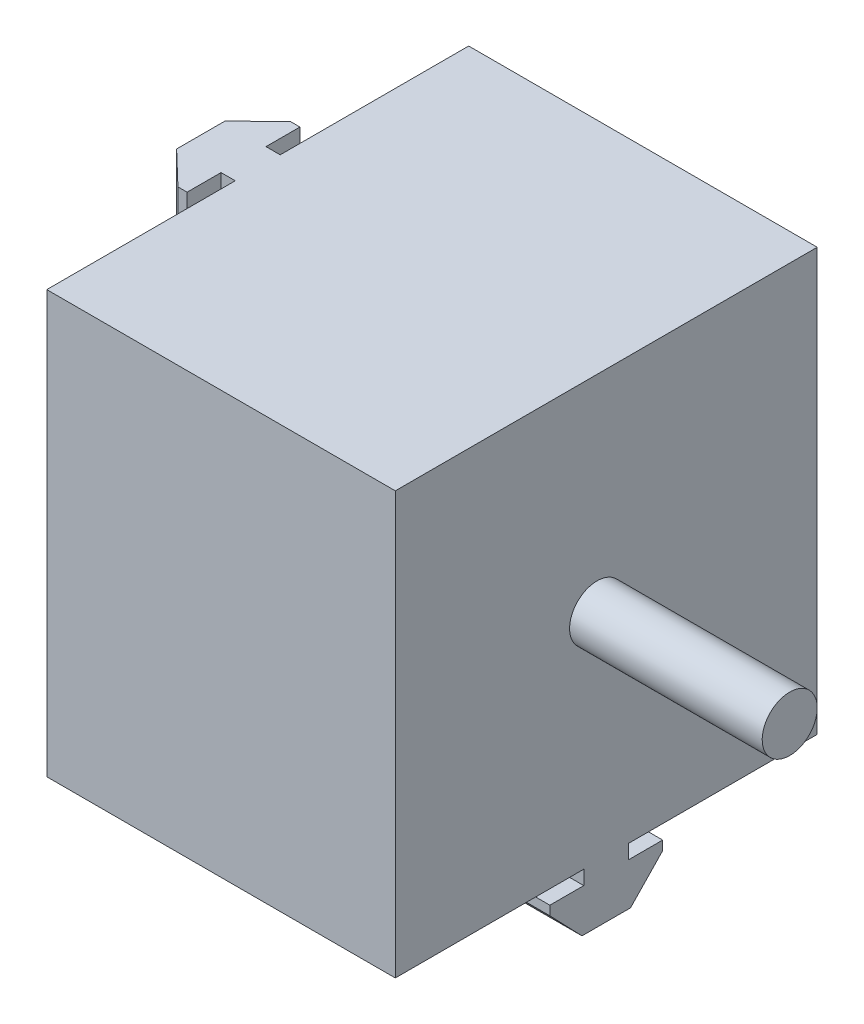
ISO-10303-21;
HEADER;
FILE_DESCRIPTION(('STEP AP214'),'2;1');
FILE_NAME('part.step','',(''),(''),'','','');
FILE_SCHEMA(('AUTOMOTIVE_DESIGN { 1 0 10303 214 1 1 1 1 }'));
ENDSEC;
DATA;
#1=APPLICATION_CONTEXT('core data for automotive mechanical design processes');
#2=APPLICATION_PROTOCOL_DEFINITION('international standard','automotive_design',2000,#1);
#3=PRODUCT_CONTEXT('',#1,'mechanical');
#4=PRODUCT('Part','Part','',(#3));
#5=PRODUCT_RELATED_PRODUCT_CATEGORY('part','',(#4));
#6=PRODUCT_DEFINITION_FORMATION('','',#4);
#7=PRODUCT_DEFINITION_CONTEXT('part definition',#1,'design');
#8=PRODUCT_DEFINITION('design','',#6,#7);
#9=PRODUCT_DEFINITION_SHAPE('','',#8);
#10=(LENGTH_UNIT() NAMED_UNIT(*) SI_UNIT(.MILLI.,.METRE.));
#11=(NAMED_UNIT(*) PLANE_ANGLE_UNIT() SI_UNIT($,.RADIAN.));
#12=(NAMED_UNIT(*) SI_UNIT($,.STERADIAN.) SOLID_ANGLE_UNIT());
#13=UNCERTAINTY_MEASURE_WITH_UNIT(LENGTH_MEASURE(1.E-05),#10,'distance_accuracy_value','');
#14=(GEOMETRIC_REPRESENTATION_CONTEXT(3) GLOBAL_UNCERTAINTY_ASSIGNED_CONTEXT((#13)) GLOBAL_UNIT_ASSIGNED_CONTEXT((#10,
#11,#12)) REPRESENTATION_CONTEXT('',''));
#15=CARTESIAN_POINT('',(0.,0.,0.));
#16=DIRECTION('',(0.,0.,1.));
#17=DIRECTION('',(1.,0.,0.));
#18=AXIS2_PLACEMENT_3D('',#15,#16,#17);
#19=CARTESIAN_POINT('',(129.653184518172,-19.9,0.));
#20=DIRECTION('',(0.,-1.,0.));
#21=DIRECTION('',(1.,0.,0.));
#22=AXIS2_PLACEMENT_3D('',#19,#20,#21);
#23=PLANE('',#22);
#24=DIRECTION('',(0.,0.,-1.));
#25=VECTOR('',#24,1.);
#26=CARTESIAN_POINT('',(-15.9,-19.9,0.));
#27=LINE('',#26,#25);
#28=CARTESIAN_POINT('',(-15.9,-19.9,23.65));
#29=VERTEX_POINT('',#28);
#30=CARTESIAN_POINT('',(-15.9,-19.9,3.1));
#31=VERTEX_POINT('',#30);
#32=EDGE_CURVE('E262',#29,#31,#27,.T.);
#33=ORIENTED_EDGE('',*,*,#32,.T.);
#34=DIRECTION('',(1.,0.,0.));
#35=VECTOR('',#34,1.);
#36=CARTESIAN_POINT('',(22.1,-19.9,3.1));
#37=LINE('',#36,#35);
#38=CARTESIAN_POINT('',(22.1,-19.9,3.1));
#39=VERTEX_POINT('',#38);
#40=EDGE_CURVE('E48',#31,#39,#37,.T.);
#41=ORIENTED_EDGE('',*,*,#40,.T.);
#42=DIRECTION('',(0.,0.,-1.));
#43=VECTOR('',#42,1.);
#44=CARTESIAN_POINT('',(22.1,-19.9,0.));
#45=LINE('',#44,#43);
#46=CARTESIAN_POINT('',(22.1,-19.9,23.65));
#47=VERTEX_POINT('',#46);
#48=EDGE_CURVE('E201',#47,#39,#45,.T.);
#49=ORIENTED_EDGE('',*,*,#48,.F.);
#50=DIRECTION('',(-1.,0.,0.));
#51=VECTOR('',#50,1.);
#52=CARTESIAN_POINT('',(129.653184518172,-19.9,23.65));
#53=LINE('',#52,#51);
#54=EDGE_CURVE('E335',#47,#29,#53,.T.);
#55=ORIENTED_EDGE('',*,*,#54,.T.);
#56=EDGE_LOOP('',(#33,#41,#49,#55));
#57=FACE_BOUND('',#56,.T.);
#58=ADVANCED_FACE('F33',(#57),#23,.T.);
#59=CARTESIAN_POINT('',(-22.1,26.1,52.2));
#60=DIRECTION('',(0.,-1.,0.));
#61=DIRECTION('',(0.,0.,-1.));
#62=AXIS2_PLACEMENT_3D('',#59,#60,#61);
#63=PLANE('',#62);
#64=DIRECTION('',(1.,0.,0.));
#65=VECTOR('',#64,1.);
#66=CARTESIAN_POINT('',(22.1,26.1,3.1));
#67=LINE('',#66,#65);
#68=CARTESIAN_POINT('',(-15.9,26.1,3.1));
#69=VERTEX_POINT('',#68);
#70=CARTESIAN_POINT('',(22.1,26.1,3.1));
#71=VERTEX_POINT('',#70);
#72=EDGE_CURVE('E188',#69,#71,#67,.T.);
#73=ORIENTED_EDGE('',*,*,#72,.F.);
#74=DIRECTION('',(0.,0.,-1.));
#75=VECTOR('',#74,1.);
#76=CARTESIAN_POINT('',(-15.9,26.1,0.));
#77=LINE('',#76,#75);
#78=CARTESIAN_POINT('',(-15.9,26.1,23.65));
#79=VERTEX_POINT('',#78);
#80=EDGE_CURVE('E266',#79,#69,#77,.T.);
#81=ORIENTED_EDGE('',*,*,#80,.F.);
#82=DIRECTION('',(1.,0.,0.));
#83=VECTOR('',#82,1.);
#84=CARTESIAN_POINT('',(-15.9,26.1,23.65));
#85=LINE('',#84,#83);
#86=CARTESIAN_POINT('',(-17.45,26.1,23.65));
#87=VERTEX_POINT('',#86);
#88=EDGE_CURVE('E278',#87,#79,#85,.T.);
#89=ORIENTED_EDGE('',*,*,#88,.F.);
#90=DIRECTION('',(0.,0.,1.));
#91=VECTOR('',#90,1.);
#92=CARTESIAN_POINT('',(-17.45,26.1,23.65));
#93=LINE('',#92,#91);
#94=CARTESIAN_POINT('',(-17.45,26.1,19.95));
#95=VERTEX_POINT('',#94);
#96=EDGE_CURVE('E275',#95,#87,#93,.T.);
#97=ORIENTED_EDGE('',*,*,#96,.F.);
#98=DIRECTION('',(1.,0.,0.));
#99=VECTOR('',#98,1.);
#100=CARTESIAN_POINT('',(-17.45,26.1,19.95));
#101=LINE('',#100,#99);
#102=CARTESIAN_POINT('',(-18.45,26.1,19.95));
#103=VERTEX_POINT('',#102);
#104=EDGE_CURVE('E272',#103,#95,#101,.T.);
#105=ORIENTED_EDGE('',*,*,#104,.F.);
#106=DIRECTION('',(0.721343873517788,0.,-0.692577083174396));
#107=VECTOR('',#106,1.);
#108=CARTESIAN_POINT('',(-18.45,26.1,19.95));
#109=LINE('',#108,#107);
#110=CARTESIAN_POINT('',(-22.1,26.1,23.4544400408624));
#111=VERTEX_POINT('',#110);
#112=EDGE_CURVE('E259',#111,#103,#109,.T.);
#113=ORIENTED_EDGE('',*,*,#112,.F.);
#114=DIRECTION('',(0.,0.,-1.));
#115=VECTOR('',#114,1.);
#116=CARTESIAN_POINT('',(-22.1,26.1,52.2));
#117=LINE('',#116,#115);
#118=CARTESIAN_POINT('',(-22.1,26.1,28.7455599591376));
#119=VERTEX_POINT('',#118);
#120=EDGE_CURVE('E207',#119,#111,#117,.T.);
#121=ORIENTED_EDGE('',*,*,#120,.F.);
#122=DIRECTION('',(0.721343873517787,0.,0.692577083174397));
#123=VECTOR('',#122,1.);
#124=CARTESIAN_POINT('',(-18.45,26.1,32.25));
#125=LINE('',#124,#123);
#126=CARTESIAN_POINT('',(-18.45,26.1,32.25));
#127=VERTEX_POINT('',#126);
#128=EDGE_CURVE('E296',#119,#127,#125,.T.);
#129=ORIENTED_EDGE('',*,*,#128,.T.);
#130=DIRECTION('',(1.,0.,0.));
#131=VECTOR('',#130,1.);
#132=CARTESIAN_POINT('',(-17.45,26.1,32.25));
#133=LINE('',#132,#131);
#134=CARTESIAN_POINT('',(-17.45,26.1,32.25));
#135=VERTEX_POINT('',#134);
#136=EDGE_CURVE('E305',#127,#135,#133,.T.);
#137=ORIENTED_EDGE('',*,*,#136,.T.);
#138=DIRECTION('',(0.,0.,-1.));
#139=VECTOR('',#138,1.);
#140=CARTESIAN_POINT('',(-17.45,26.1,28.55));
#141=LINE('',#140,#139);
#142=CARTESIAN_POINT('',(-17.45,26.1,28.55));
#143=VERTEX_POINT('',#142);
#144=EDGE_CURVE('E307',#135,#143,#141,.T.);
#145=ORIENTED_EDGE('',*,*,#144,.T.);
#146=DIRECTION('',(1.,0.,0.));
#147=VECTOR('',#146,1.);
#148=CARTESIAN_POINT('',(-15.9,26.1,28.55));
#149=LINE('',#148,#147);
#150=CARTESIAN_POINT('',(-15.9,26.1,28.55));
#151=VERTEX_POINT('',#150);
#152=EDGE_CURVE('E309',#143,#151,#149,.T.);
#153=ORIENTED_EDGE('',*,*,#152,.T.);
#154=DIRECTION('',(0.,0.,1.));
#155=VECTOR('',#154,1.);
#156=CARTESIAN_POINT('',(-15.9,26.1,52.2));
#157=LINE('',#156,#155);
#158=CARTESIAN_POINT('',(-15.9,26.1,49.1));
#159=VERTEX_POINT('',#158);
#160=EDGE_CURVE('E300',#151,#159,#157,.T.);
#161=ORIENTED_EDGE('',*,*,#160,.T.);
#162=DIRECTION('',(1.,0.,0.));
#163=VECTOR('',#162,1.);
#164=CARTESIAN_POINT('',(22.1,26.1,49.1));
#165=LINE('',#164,#163);
#166=CARTESIAN_POINT('',(22.1,26.1,49.1));
#167=VERTEX_POINT('',#166);
#168=EDGE_CURVE('E202',#159,#167,#165,.T.);
#169=ORIENTED_EDGE('',*,*,#168,.T.);
#170=DIRECTION('',(0.,0.,-1.));
#171=VECTOR('',#170,1.);
#172=CARTESIAN_POINT('',(22.1,26.1,52.2));
#173=LINE('',#172,#171);
#174=EDGE_CURVE('E199',#167,#71,#173,.T.);
#175=ORIENTED_EDGE('',*,*,#174,.T.);
#176=EDGE_LOOP('',(#73,#81,#89,#97,#105,#113,#121,#129,#137,#145,#153,#161,#169,#175));
#177=FACE_BOUND('',#176,.T.);
#178=ADVANCED_FACE('F204',(#177),#63,.F.);
#179=CARTESIAN_POINT('',(22.1,26.1,52.2));
#180=DIRECTION('',(-1.,0.,0.));
#181=DIRECTION('',(0.,-1.,0.));
#182=AXIS2_PLACEMENT_3D('',#179,#180,#181);
#183=PLANE('',#182);
#184=CARTESIAN_POINT('',(22.1,3.6,27.1));
#185=DIRECTION('',(-1.,0.,0.));
#186=DIRECTION('',(0.,-1.,0.));
#187=AXIS2_PLACEMENT_3D('',#184,#185,#186);
#188=CIRCLE('',#187,3.);
#189=CARTESIAN_POINT('',(22.1,0.599999999999995,27.1));
#190=VERTEX_POINT('',#189);
#191=EDGE_CURVE('E11',#190,#190,#188,.F.);
#192=ORIENTED_EDGE('',*,*,#191,.F.);
#193=EDGE_LOOP('',(#192));
#194=FACE_BOUND('',#193,.T.);
#195=DIRECTION('',(0.,-1.,0.));
#196=VECTOR('',#195,1.);
#197=CARTESIAN_POINT('',(22.1,188.847401986937,3.1));
#198=LINE('',#197,#196);
#199=EDGE_CURVE('E191',#71,#39,#198,.T.);
#200=ORIENTED_EDGE('',*,*,#199,.F.);
#201=ORIENTED_EDGE('',*,*,#174,.F.);
#202=DIRECTION('',(0.,-1.,0.));
#203=VECTOR('',#202,1.);
#204=CARTESIAN_POINT('',(22.1,198.903184518172,49.1));
#205=LINE('',#204,#203);
#206=CARTESIAN_POINT('',(22.1,-19.9,49.1));
#207=VERTEX_POINT('',#206);
#208=EDGE_CURVE('E56',#167,#207,#205,.T.);
#209=ORIENTED_EDGE('',*,*,#208,.T.);
#210=DIRECTION('',(0.,0.,1.));
#211=VECTOR('',#210,1.);
#212=CARTESIAN_POINT('',(22.1,-19.9,52.2));
#213=LINE('',#212,#211);
#214=CARTESIAN_POINT('',(22.1000000000001,-19.9,28.55));
#215=VERTEX_POINT('',#214);
#216=EDGE_CURVE('E353',#215,#207,#213,.T.);
#217=ORIENTED_EDGE('',*,*,#216,.F.);
#218=DIRECTION('',(0.,1.,0.));
#219=VECTOR('',#218,1.);
#220=CARTESIAN_POINT('',(22.1,-19.9,28.55));
#221=LINE('',#220,#219);
#222=CARTESIAN_POINT('',(22.1000000000001,-21.45,28.55));
#223=VERTEX_POINT('',#222);
#224=EDGE_CURVE('E362',#223,#215,#221,.T.);
#225=ORIENTED_EDGE('',*,*,#224,.F.);
#226=DIRECTION('',(0.,0.,-1.));
#227=VECTOR('',#226,1.);
#228=CARTESIAN_POINT('',(22.1,-21.45,28.55));
#229=LINE('',#228,#227);
#230=CARTESIAN_POINT('',(22.1000000000001,-21.45,32.25));
#231=VERTEX_POINT('',#230);
#232=EDGE_CURVE('E359',#231,#223,#229,.T.);
#233=ORIENTED_EDGE('',*,*,#232,.F.);
#234=DIRECTION('',(0.,1.,0.));
#235=VECTOR('',#234,1.);
#236=CARTESIAN_POINT('',(22.1,-21.45,32.25));
#237=LINE('',#236,#235);
#238=CARTESIAN_POINT('',(22.1000000000001,-22.45,32.25));
#239=VERTEX_POINT('',#238);
#240=EDGE_CURVE('E356',#239,#231,#237,.T.);
#241=ORIENTED_EDGE('',*,*,#240,.F.);
#242=DIRECTION('',(0.,0.721343873517787,0.692577083174397));
#243=VECTOR('',#242,1.);
#244=CARTESIAN_POINT('',(22.1,-22.45,32.25));
#245=LINE('',#244,#243);
#246=CARTESIAN_POINT('',(22.1000000000001,-26.1,28.7455599591376));
#247=VERTEX_POINT('',#246);
#248=EDGE_CURVE('E348',#247,#239,#245,.T.);
#249=ORIENTED_EDGE('',*,*,#248,.F.);
#250=DIRECTION('',(0.,0.,-1.));
#251=VECTOR('',#250,1.);
#252=CARTESIAN_POINT('',(22.1,-26.1,52.2));
#253=LINE('',#252,#251);
#254=CARTESIAN_POINT('',(22.1,-26.1,23.4544400408625));
#255=VERTEX_POINT('',#254);
#256=EDGE_CURVE('E212',#247,#255,#253,.T.);
#257=ORIENTED_EDGE('',*,*,#256,.T.);
#258=DIRECTION('',(0.,0.721343873517786,-0.692577083174397));
#259=VECTOR('',#258,1.);
#260=CARTESIAN_POINT('',(22.1,-22.45,19.95));
#261=LINE('',#260,#259);
#262=CARTESIAN_POINT('',(22.1,-22.45,19.95));
#263=VERTEX_POINT('',#262);
#264=EDGE_CURVE('E326',#255,#263,#261,.T.);
#265=ORIENTED_EDGE('',*,*,#264,.T.);
#266=DIRECTION('',(0.,1.,0.));
#267=VECTOR('',#266,1.);
#268=CARTESIAN_POINT('',(22.1,-21.45,19.95));
#269=LINE('',#268,#267);
#270=CARTESIAN_POINT('',(22.1,-21.45,19.95));
#271=VERTEX_POINT('',#270);
#272=EDGE_CURVE('E328',#263,#271,#269,.T.);
#273=ORIENTED_EDGE('',*,*,#272,.T.);
#274=DIRECTION('',(0.,0.,1.));
#275=VECTOR('',#274,1.);
#276=CARTESIAN_POINT('',(22.1,-21.45,23.65));
#277=LINE('',#276,#275);
#278=CARTESIAN_POINT('',(22.1,-21.45,23.65));
#279=VERTEX_POINT('',#278);
#280=EDGE_CURVE('E330',#271,#279,#277,.T.);
#281=ORIENTED_EDGE('',*,*,#280,.T.);
#282=DIRECTION('',(0.,1.,0.));
#283=VECTOR('',#282,1.);
#284=CARTESIAN_POINT('',(22.1,-19.9,23.65));
#285=LINE('',#284,#283);
#286=EDGE_CURVE('E332',#279,#47,#285,.T.);
#287=ORIENTED_EDGE('',*,*,#286,.T.);
#288=ORIENTED_EDGE('',*,*,#48,.T.);
#289=EDGE_LOOP('',(#200,#201,#209,#217,#225,#233,#241,#249,#257,#265,#273,#281,#287,#288));
#290=FACE_BOUND('',#289,.T.);
#291=ADVANCED_FACE('F35',(#194,#290),#183,.F.);
#292=CARTESIAN_POINT('',(129.653184518172,-19.9,52.2));
#293=DIRECTION('',(0.,1.,0.));
#294=DIRECTION('',(-1.,0.,0.));
#295=AXIS2_PLACEMENT_3D('',#292,#293,#294);
#296=PLANE('',#295);
#297=DIRECTION('',(1.,0.,0.));
#298=VECTOR('',#297,1.);
#299=CARTESIAN_POINT('',(22.1,-19.9,49.1));
#300=LINE('',#299,#298);
#301=CARTESIAN_POINT('',(-15.9,-19.9,49.1));
#302=VERTEX_POINT('',#301);
#303=EDGE_CURVE('E451',#302,#207,#300,.T.);
#304=ORIENTED_EDGE('',*,*,#303,.F.);
#305=DIRECTION('',(0.,0.,1.));
#306=VECTOR('',#305,1.);
#307=CARTESIAN_POINT('',(-15.9,-19.9,52.2));
#308=LINE('',#307,#306);
#309=CARTESIAN_POINT('',(-15.8999999999999,-19.9,28.55));
#310=VERTEX_POINT('',#309);
#311=EDGE_CURVE('E297',#310,#302,#308,.T.);
#312=ORIENTED_EDGE('',*,*,#311,.F.);
#313=DIRECTION('',(-1.,0.,0.));
#314=VECTOR('',#313,1.);
#315=CARTESIAN_POINT('',(129.653184518172,-19.9,28.55));
#316=LINE('',#315,#314);
#317=EDGE_CURVE('E352',#215,#310,#316,.T.);
#318=ORIENTED_EDGE('',*,*,#317,.F.);
#319=ORIENTED_EDGE('',*,*,#216,.T.);
#320=EDGE_LOOP('',(#304,#312,#318,#319));
#321=FACE_BOUND('',#320,.T.);
#322=ADVANCED_FACE('F469',(#321),#296,.F.);
#323=CARTESIAN_POINT('',(-22.1,-26.1,52.2));
#324=DIRECTION('',(0.,1.,0.));
#325=DIRECTION('',(0.,0.,1.));
#326=AXIS2_PLACEMENT_3D('',#323,#324,#325);
#327=PLANE('',#326);
#328=DIRECTION('',(0.,0.,1.));
#329=VECTOR('',#328,1.);
#330=CARTESIAN_POINT('',(-15.8999999999999,-26.1,52.2));
#331=LINE('',#330,#329);
#332=CARTESIAN_POINT('',(-15.8999999999999,-26.1,28.7455599591376));
#333=VERTEX_POINT('',#332);
#334=CARTESIAN_POINT('',(-15.8999999999999,-26.1,23.4544400408624));
#335=VERTEX_POINT('',#334);
#336=EDGE_CURVE('E224',#333,#335,#331,.F.);
#337=ORIENTED_EDGE('',*,*,#336,.T.);
#338=DIRECTION('',(-1.,0.,0.));
#339=VECTOR('',#338,1.);
#340=CARTESIAN_POINT('',(129.653184518172,-26.1,23.4544400408624));
#341=LINE('',#340,#339);
#342=EDGE_CURVE('E343',#255,#335,#341,.T.);
#343=ORIENTED_EDGE('',*,*,#342,.F.);
#344=ORIENTED_EDGE('',*,*,#256,.F.);
#345=DIRECTION('',(-1.,0.,0.));
#346=VECTOR('',#345,1.);
#347=CARTESIAN_POINT('',(129.653184518172,-26.1,28.7455599591376));
#348=LINE('',#347,#346);
#349=EDGE_CURVE('E374',#247,#333,#348,.T.);
#350=ORIENTED_EDGE('',*,*,#349,.T.);
#351=EDGE_LOOP('',(#337,#343,#344,#350));
#352=FACE_BOUND('',#351,.T.);
#353=ADVANCED_FACE('F474',(#352),#327,.F.);
#354=CARTESIAN_POINT('',(129.653184518172,-22.45,19.95));
#355=DIRECTION('',(0.,-0.692577083174397,-0.721343873517786));
#356=DIRECTION('',(0.,0.721343873517786,-0.692577083174397));
#357=AXIS2_PLACEMENT_3D('',#354,#355,#356);
#358=PLANE('',#357);
#359=ORIENTED_EDGE('',*,*,#342,.T.);
#360=DIRECTION('',(0.,-0.721343873517786,0.692577083174397));
#361=VECTOR('',#360,1.);
#362=CARTESIAN_POINT('',(-15.8999999999999,-22.45,19.95));
#363=LINE('',#362,#361);
#364=CARTESIAN_POINT('',(-15.8999999999999,-22.45,19.95));
#365=VERTEX_POINT('',#364);
#366=EDGE_CURVE('E249',#365,#335,#363,.T.);
#367=ORIENTED_EDGE('',*,*,#366,.F.);
#368=DIRECTION('',(-1.,0.,0.));
#369=VECTOR('',#368,1.);
#370=CARTESIAN_POINT('',(129.653184518172,-22.45,19.95));
#371=LINE('',#370,#369);
#372=EDGE_CURVE('E345',#263,#365,#371,.T.);
#373=ORIENTED_EDGE('',*,*,#372,.F.);
#374=ORIENTED_EDGE('',*,*,#264,.F.);
#375=EDGE_LOOP('',(#359,#367,#373,#374));
#376=FACE_BOUND('',#375,.T.);
#377=ADVANCED_FACE('F386',(#376),#358,.T.);
#378=CARTESIAN_POINT('',(-22.1,26.1,52.2));
#379=DIRECTION('',(1.,0.,0.));
#380=DIRECTION('',(0.,1.,0.));
#381=AXIS2_PLACEMENT_3D('',#378,#379,#380);
#382=PLANE('',#381);
#383=DIRECTION('',(0.,-1.,0.));
#384=VECTOR('',#383,1.);
#385=CARTESIAN_POINT('',(-22.1,133.653184518172,23.4544400408624));
#386=LINE('',#385,#384);
#387=CARTESIAN_POINT('',(-22.1,-19.9,23.4544400408624));
#388=VERTEX_POINT('',#387);
#389=EDGE_CURVE('E290',#111,#388,#386,.T.);
#390=ORIENTED_EDGE('',*,*,#389,.T.);
#391=DIRECTION('',(0.,0.,1.));
#392=VECTOR('',#391,1.);
#393=CARTESIAN_POINT('',(-22.1,-19.9,52.2));
#394=LINE('',#393,#392);
#395=CARTESIAN_POINT('',(-22.1,-19.9,28.7455599591376));
#396=VERTEX_POINT('',#395);
#397=EDGE_CURVE('E349',#388,#396,#394,.T.);
#398=ORIENTED_EDGE('',*,*,#397,.T.);
#399=DIRECTION('',(0.,-1.,0.));
#400=VECTOR('',#399,1.);
#401=CARTESIAN_POINT('',(-22.1,198.903184518172,28.7455599591376));
#402=LINE('',#401,#400);
#403=EDGE_CURVE('E320',#119,#396,#402,.T.);
#404=ORIENTED_EDGE('',*,*,#403,.F.);
#405=ORIENTED_EDGE('',*,*,#120,.T.);
#406=EDGE_LOOP('',(#390,#398,#404,#405));
#407=FACE_BOUND('',#406,.T.);
#408=ADVANCED_FACE('F426',(#407),#382,.F.);
#409=CARTESIAN_POINT('',(129.653184518172,-19.9,28.55));
#410=DIRECTION('',(0.,0.,-1.));
#411=DIRECTION('',(0.,1.,0.));
#412=AXIS2_PLACEMENT_3D('',#409,#410,#411);
#413=PLANE('',#412);
#414=DIRECTION('',(0.,-1.,0.));
#415=VECTOR('',#414,1.);
#416=CARTESIAN_POINT('',(-17.45,198.903184518172,28.55));
#417=LINE('',#416,#415);
#418=CARTESIAN_POINT('',(-17.4499999999999,-19.9,28.55));
#419=VERTEX_POINT('',#418);
#420=EDGE_CURVE('E314',#143,#419,#417,.T.);
#421=ORIENTED_EDGE('',*,*,#420,.T.);
#422=DIRECTION('',(1.,0.,0.));
#423=VECTOR('',#422,1.);
#424=CARTESIAN_POINT('',(129.653184518172,-19.9,28.55));
#425=LINE('',#424,#423);
#426=EDGE_CURVE('E231',#419,#310,#425,.T.);
#427=ORIENTED_EDGE('',*,*,#426,.T.);
#428=DIRECTION('',(0.,-1.,0.));
#429=VECTOR('',#428,1.);
#430=CARTESIAN_POINT('',(-15.9,198.903184518172,28.55));
#431=LINE('',#430,#429);
#432=EDGE_CURVE('E222',#151,#310,#431,.T.);
#433=ORIENTED_EDGE('',*,*,#432,.F.);
#434=ORIENTED_EDGE('',*,*,#152,.F.);
#435=EDGE_LOOP('',(#421,#427,#433,#434));
#436=FACE_BOUND('',#435,.T.);
#437=ADVANCED_FACE('F441',(#436),#413,.F.);
#438=CARTESIAN_POINT('',(129.653184518172,-19.9,23.65));
#439=DIRECTION('',(0.,0.,-1.));
#440=DIRECTION('',(-1.,0.,0.));
#441=AXIS2_PLACEMENT_3D('',#438,#439,#440);
#442=PLANE('',#441);
#443=DIRECTION('',(1.,0.,0.));
#444=VECTOR('',#443,1.);
#445=CARTESIAN_POINT('',(129.653184518172,-19.9,23.65));
#446=LINE('',#445,#444);
#447=CARTESIAN_POINT('',(-17.45,-19.9,23.65));
#448=VERTEX_POINT('',#447);
#449=EDGE_CURVE('E225',#448,#29,#446,.T.);
#450=ORIENTED_EDGE('',*,*,#449,.F.);
#451=DIRECTION('',(0.,-1.,0.));
#452=VECTOR('',#451,1.);
#453=CARTESIAN_POINT('',(-17.45,133.653184518172,23.65));
#454=LINE('',#453,#452);
#455=EDGE_CURVE('E284',#87,#448,#454,.T.);
#456=ORIENTED_EDGE('',*,*,#455,.F.);
#457=ORIENTED_EDGE('',*,*,#88,.T.);
#458=DIRECTION('',(0.,-1.,0.));
#459=VECTOR('',#458,1.);
#460=CARTESIAN_POINT('',(-15.9,133.653184518172,23.65));
#461=LINE('',#460,#459);
#462=EDGE_CURVE('E218',#79,#29,#461,.T.);
#463=ORIENTED_EDGE('',*,*,#462,.T.);
#464=EDGE_LOOP('',(#450,#456,#457,#463));
#465=FACE_BOUND('',#464,.T.);
#466=ADVANCED_FACE('F407',(#465),#442,.T.);
#467=DIRECTION('',(0.,0.,-1.));
#468=VECTOR('',#467,1.);
#469=CARTESIAN_POINT('',(-17.45,-19.9,28.55));
#470=LINE('',#469,#468);
#471=CARTESIAN_POINT('',(-17.45,-19.9,32.25));
#472=VERTEX_POINT('',#471);
#473=EDGE_CURVE('E299',#472,#419,#470,.T.);
#474=ORIENTED_EDGE('',*,*,#473,.F.);
#475=DIRECTION('',(1.,0.,0.));
#476=VECTOR('',#475,1.);
#477=CARTESIAN_POINT('',(-17.45,-19.9,32.25));
#478=LINE('',#477,#476);
#479=CARTESIAN_POINT('',(-18.45,-19.9,32.25));
#480=VERTEX_POINT('',#479);
#481=EDGE_CURVE('E223',#480,#472,#478,.T.);
#482=ORIENTED_EDGE('',*,*,#481,.F.);
#483=DIRECTION('',(0.721343873517787,0.,0.692577083174397));
#484=VECTOR('',#483,1.);
#485=CARTESIAN_POINT('',(-18.45,-19.9,32.25));
#486=LINE('',#485,#484);
#487=EDGE_CURVE('E220',#396,#480,#486,.T.);
#488=ORIENTED_EDGE('',*,*,#487,.F.);
#489=ORIENTED_EDGE('',*,*,#397,.F.);
#490=DIRECTION('',(0.721343873517788,0.,-0.692577083174396));
#491=VECTOR('',#490,1.);
#492=CARTESIAN_POINT('',(-18.45,-19.9,19.95));
#493=LINE('',#492,#491);
#494=CARTESIAN_POINT('',(-18.45,-19.9,19.95));
#495=VERTEX_POINT('',#494);
#496=EDGE_CURVE('E216',#388,#495,#493,.T.);
#497=ORIENTED_EDGE('',*,*,#496,.T.);
#498=DIRECTION('',(1.,0.,0.));
#499=VECTOR('',#498,1.);
#500=CARTESIAN_POINT('',(-17.45,-19.9,19.95));
#501=LINE('',#500,#499);
#502=CARTESIAN_POINT('',(-17.45,-19.9,19.95));
#503=VERTEX_POINT('',#502);
#504=EDGE_CURVE('E219',#495,#503,#501,.T.);
#505=ORIENTED_EDGE('',*,*,#504,.T.);
#506=DIRECTION('',(0.,0.,1.));
#507=VECTOR('',#506,1.);
#508=CARTESIAN_POINT('',(-17.45,-19.9,23.65));
#509=LINE('',#508,#507);
#510=EDGE_CURVE('E265',#503,#448,#509,.T.);
#511=ORIENTED_EDGE('',*,*,#510,.T.);
#512=ORIENTED_EDGE('',*,*,#449,.T.);
#513=DIRECTION('',(0.,0.,-1.));
#514=VECTOR('',#513,1.);
#515=CARTESIAN_POINT('',(-15.8999999999999,-19.9,171.790684518172));
#516=LINE('',#515,#514);
#517=EDGE_CURVE('E226',#310,#29,#516,.T.);
#518=ORIENTED_EDGE('',*,*,#517,.F.);
#519=ORIENTED_EDGE('',*,*,#426,.F.);
#520=EDGE_LOOP('',(#474,#482,#488,#489,#497,#505,#511,#512,#518,#519));
#521=FACE_BOUND('',#520,.T.);
#522=ADVANCED_FACE('F410',(#521),#296,.F.);
#523=CARTESIAN_POINT('',(129.653184518172,-22.45,32.25));
#524=DIRECTION('',(0.,0.692577083174397,-0.721343873517787));
#525=DIRECTION('',(0.,0.721343873517787,0.692577083174397));
#526=AXIS2_PLACEMENT_3D('',#523,#524,#525);
#527=PLANE('',#526);
#528=DIRECTION('',(0.,-0.721343873517787,-0.692577083174397));
#529=VECTOR('',#528,1.);
#530=CARTESIAN_POINT('',(-15.8999999999999,-22.45,32.25));
#531=LINE('',#530,#529);
#532=CARTESIAN_POINT('',(-15.8999999999999,-22.45,32.25));
#533=VERTEX_POINT('',#532);
#534=EDGE_CURVE('E256',#533,#333,#531,.T.);
#535=ORIENTED_EDGE('',*,*,#534,.T.);
#536=ORIENTED_EDGE('',*,*,#349,.F.);
#537=ORIENTED_EDGE('',*,*,#248,.T.);
#538=DIRECTION('',(-1.,0.,0.));
#539=VECTOR('',#538,1.);
#540=CARTESIAN_POINT('',(129.653184518172,-22.45,32.25));
#541=LINE('',#540,#539);
#542=EDGE_CURVE('E376',#239,#533,#541,.T.);
#543=ORIENTED_EDGE('',*,*,#542,.T.);
#544=EDGE_LOOP('',(#535,#536,#537,#543));
#545=FACE_BOUND('',#544,.T.);
#546=ADVANCED_FACE('F503',(#545),#527,.F.);
#547=CARTESIAN_POINT('',(129.653184518172,-21.45,32.25));
#548=DIRECTION('',(0.,0.,-1.));
#549=DIRECTION('',(-1.,0.,0.));
#550=AXIS2_PLACEMENT_3D('',#547,#548,#549);
#551=PLANE('',#550);
#552=DIRECTION('',(-1.,0.,0.));
#553=VECTOR('',#552,1.);
#554=CARTESIAN_POINT('',(129.653184518172,-21.45,32.25));
#555=LINE('',#554,#553);
#556=CARTESIAN_POINT('',(-15.8999999999999,-21.45,32.25));
#557=VERTEX_POINT('',#556);
#558=EDGE_CURVE('E371',#231,#557,#555,.T.);
#559=ORIENTED_EDGE('',*,*,#558,.T.);
#560=DIRECTION('',(0.,-1.,0.));
#561=VECTOR('',#560,1.);
#562=CARTESIAN_POINT('',(-15.8999999999999,-21.45,32.25));
#563=LINE('',#562,#561);
#564=EDGE_CURVE('E254',#557,#533,#563,.T.);
#565=ORIENTED_EDGE('',*,*,#564,.T.);
#566=ORIENTED_EDGE('',*,*,#542,.F.);
#567=ORIENTED_EDGE('',*,*,#240,.T.);
#568=EDGE_LOOP('',(#559,#565,#566,#567));
#569=FACE_BOUND('',#568,.T.);
#570=ADVANCED_FACE('F499',(#569),#551,.F.);
#571=CARTESIAN_POINT('',(129.653184518172,-21.45,28.55));
#572=DIRECTION('',(0.,-1.,0.));
#573=DIRECTION('',(1.,0.,0.));
#574=AXIS2_PLACEMENT_3D('',#571,#572,#573);
#575=PLANE('',#574);
#576=DIRECTION('',(-1.,0.,0.));
#577=VECTOR('',#576,1.);
#578=CARTESIAN_POINT('',(129.653184518172,-21.45,28.55));
#579=LINE('',#578,#577);
#580=CARTESIAN_POINT('',(-15.8999999999999,-21.45,28.55));
#581=VERTEX_POINT('',#580);
#582=EDGE_CURVE('E368',#223,#581,#579,.T.);
#583=ORIENTED_EDGE('',*,*,#582,.T.);
#584=DIRECTION('',(0.,0.,1.));
#585=VECTOR('',#584,1.);
#586=CARTESIAN_POINT('',(-15.8999999999999,-21.45,28.55));
#587=LINE('',#586,#585);
#588=EDGE_CURVE('E252',#581,#557,#587,.T.);
#589=ORIENTED_EDGE('',*,*,#588,.T.);
#590=ORIENTED_EDGE('',*,*,#558,.F.);
#591=ORIENTED_EDGE('',*,*,#232,.T.);
#592=EDGE_LOOP('',(#583,#589,#590,#591));
#593=FACE_BOUND('',#592,.T.);
#594=ADVANCED_FACE('F495',(#593),#575,.F.);
#595=ORIENTED_EDGE('',*,*,#317,.T.);
#596=DIRECTION('',(0.,-1.,0.));
#597=VECTOR('',#596,1.);
#598=CARTESIAN_POINT('',(-15.8999999999999,-19.9,28.55));
#599=LINE('',#598,#597);
#600=EDGE_CURVE('E250',#310,#581,#599,.T.);
#601=ORIENTED_EDGE('',*,*,#600,.T.);
#602=ORIENTED_EDGE('',*,*,#582,.F.);
#603=ORIENTED_EDGE('',*,*,#224,.T.);
#604=EDGE_LOOP('',(#595,#601,#602,#603));
#605=FACE_BOUND('',#604,.T.);
#606=ADVANCED_FACE('F490',(#605),#413,.F.);
#607=CARTESIAN_POINT('',(129.653184518172,-21.45,19.95));
#608=DIRECTION('',(0.,0.,-1.));
#609=DIRECTION('',(-1.,0.,0.));
#610=AXIS2_PLACEMENT_3D('',#607,#608,#609);
#611=PLANE('',#610);
#612=DIRECTION('',(0.,-1.,0.));
#613=VECTOR('',#612,1.);
#614=CARTESIAN_POINT('',(-15.8999999999999,-21.45,19.95));
#615=LINE('',#614,#613);
#616=CARTESIAN_POINT('',(-15.8999999999999,-21.45,19.95));
#617=VERTEX_POINT('',#616);
#618=EDGE_CURVE('E246',#617,#365,#615,.T.);
#619=ORIENTED_EDGE('',*,*,#618,.F.);
#620=DIRECTION('',(-1.,0.,0.));
#621=VECTOR('',#620,1.);
#622=CARTESIAN_POINT('',(129.653184518172,-21.45,19.95));
#623=LINE('',#622,#621);
#624=EDGE_CURVE('E340',#271,#617,#623,.T.);
#625=ORIENTED_EDGE('',*,*,#624,.F.);
#626=ORIENTED_EDGE('',*,*,#272,.F.);
#627=ORIENTED_EDGE('',*,*,#372,.T.);
#628=EDGE_LOOP('',(#619,#625,#626,#627));
#629=FACE_BOUND('',#628,.T.);
#630=ADVANCED_FACE('F388',(#629),#611,.T.);
#631=CARTESIAN_POINT('',(129.653184518172,-21.45,23.65));
#632=DIRECTION('',(0.,1.,0.));
#633=DIRECTION('',(-1.,0.,0.));
#634=AXIS2_PLACEMENT_3D('',#631,#632,#633);
#635=PLANE('',#634);
#636=DIRECTION('',(0.,0.,-1.));
#637=VECTOR('',#636,1.);
#638=CARTESIAN_POINT('',(-15.8999999999999,-21.45,23.65));
#639=LINE('',#638,#637);
#640=CARTESIAN_POINT('',(-15.8999999999999,-21.45,23.65));
#641=VERTEX_POINT('',#640);
#642=EDGE_CURVE('E243',#641,#617,#639,.T.);
#643=ORIENTED_EDGE('',*,*,#642,.F.);
#644=DIRECTION('',(-1.,0.,0.));
#645=VECTOR('',#644,1.);
#646=CARTESIAN_POINT('',(129.653184518172,-21.45,23.65));
#647=LINE('',#646,#645);
#648=EDGE_CURVE('E338',#279,#641,#647,.T.);
#649=ORIENTED_EDGE('',*,*,#648,.F.);
#650=ORIENTED_EDGE('',*,*,#280,.F.);
#651=ORIENTED_EDGE('',*,*,#624,.T.);
#652=EDGE_LOOP('',(#643,#649,#650,#651));
#653=FACE_BOUND('',#652,.T.);
#654=ADVANCED_FACE('F395',(#653),#635,.T.);
#655=DIRECTION('',(0.,-1.,0.));
#656=VECTOR('',#655,1.);
#657=CARTESIAN_POINT('',(-15.8999999999999,-19.9,23.65));
#658=LINE('',#657,#656);
#659=EDGE_CURVE('E41',#29,#641,#658,.T.);
#660=ORIENTED_EDGE('',*,*,#659,.F.);
#661=ORIENTED_EDGE('',*,*,#54,.F.);
#662=ORIENTED_EDGE('',*,*,#286,.F.);
#663=ORIENTED_EDGE('',*,*,#648,.T.);
#664=EDGE_LOOP('',(#660,#661,#662,#663));
#665=FACE_BOUND('',#664,.T.);
#666=ADVANCED_FACE('F400',(#665),#442,.T.);
#667=CARTESIAN_POINT('',(-18.45,198.903184518172,32.25));
#668=DIRECTION('',(-0.692577083174397,0.,0.721343873517787));
#669=DIRECTION('',(0.721343873517787,0.,0.692577083174397));
#670=AXIS2_PLACEMENT_3D('',#667,#668,#669);
#671=PLANE('',#670);
#672=ORIENTED_EDGE('',*,*,#128,.F.);
#673=ORIENTED_EDGE('',*,*,#403,.T.);
#674=ORIENTED_EDGE('',*,*,#487,.T.);
#675=DIRECTION('',(0.,-1.,0.));
#676=VECTOR('',#675,1.);
#677=CARTESIAN_POINT('',(-18.45,198.903184518172,32.25));
#678=LINE('',#677,#676);
#679=EDGE_CURVE('E323',#127,#480,#678,.T.);
#680=ORIENTED_EDGE('',*,*,#679,.F.);
#681=EDGE_LOOP('',(#672,#673,#674,#680));
#682=FACE_BOUND('',#681,.T.);
#683=ADVANCED_FACE('F431',(#682),#671,.T.);
#684=CARTESIAN_POINT('',(-17.45,198.903184518172,32.25));
#685=DIRECTION('',(0.,0.,1.));
#686=DIRECTION('',(1.,0.,0.));
#687=AXIS2_PLACEMENT_3D('',#684,#685,#686);
#688=PLANE('',#687);
#689=ORIENTED_EDGE('',*,*,#136,.F.);
#690=ORIENTED_EDGE('',*,*,#679,.T.);
#691=ORIENTED_EDGE('',*,*,#481,.T.);
#692=DIRECTION('',(0.,-1.,0.));
#693=VECTOR('',#692,1.);
#694=CARTESIAN_POINT('',(-17.45,198.903184518172,32.25));
#695=LINE('',#694,#693);
#696=EDGE_CURVE('E317',#135,#472,#695,.T.);
#697=ORIENTED_EDGE('',*,*,#696,.F.);
#698=EDGE_LOOP('',(#689,#690,#691,#697));
#699=FACE_BOUND('',#698,.T.);
#700=ADVANCED_FACE('F433',(#699),#688,.T.);
#701=CARTESIAN_POINT('',(-17.45,198.903184518172,28.55));
#702=DIRECTION('',(1.,0.,0.));
#703=DIRECTION('',(0.,0.,-1.));
#704=AXIS2_PLACEMENT_3D('',#701,#702,#703);
#705=PLANE('',#704);
#706=ORIENTED_EDGE('',*,*,#144,.F.);
#707=ORIENTED_EDGE('',*,*,#696,.T.);
#708=ORIENTED_EDGE('',*,*,#473,.T.);
#709=ORIENTED_EDGE('',*,*,#420,.F.);
#710=EDGE_LOOP('',(#706,#707,#708,#709));
#711=FACE_BOUND('',#710,.T.);
#712=ADVANCED_FACE('F439',(#711),#705,.T.);
#713=CARTESIAN_POINT('',(-15.9,198.903184518172,52.2));
#714=DIRECTION('',(-1.,0.,0.));
#715=DIRECTION('',(0.,0.,1.));
#716=AXIS2_PLACEMENT_3D('',#713,#714,#715);
#717=PLANE('',#716);
#718=DIRECTION('',(0.,-1.,0.));
#719=VECTOR('',#718,1.);
#720=CARTESIAN_POINT('',(-15.9,198.903184518172,49.1));
#721=LINE('',#720,#719);
#722=EDGE_CURVE('E238',#159,#302,#721,.T.);
#723=ORIENTED_EDGE('',*,*,#722,.F.);
#724=ORIENTED_EDGE('',*,*,#160,.F.);
#725=ORIENTED_EDGE('',*,*,#432,.T.);
#726=ORIENTED_EDGE('',*,*,#311,.T.);
#727=EDGE_LOOP('',(#723,#724,#725,#726));
#728=FACE_BOUND('',#727,.T.);
#729=ADVANCED_FACE('F446',(#728),#717,.T.);
#730=CARTESIAN_POINT('',(-18.45,133.653184518172,19.95));
#731=DIRECTION('',(0.692577083174396,0.,0.721343873517788));
#732=DIRECTION('',(0.721343873517788,0.,-0.692577083174396));
#733=AXIS2_PLACEMENT_3D('',#730,#731,#732);
#734=PLANE('',#733);
#735=ORIENTED_EDGE('',*,*,#112,.T.);
#736=DIRECTION('',(0.,-1.,0.));
#737=VECTOR('',#736,1.);
#738=CARTESIAN_POINT('',(-18.45,133.653184518172,19.95));
#739=LINE('',#738,#737);
#740=EDGE_CURVE('E293',#103,#495,#739,.T.);
#741=ORIENTED_EDGE('',*,*,#740,.T.);
#742=ORIENTED_EDGE('',*,*,#496,.F.);
#743=ORIENTED_EDGE('',*,*,#389,.F.);
#744=EDGE_LOOP('',(#735,#741,#742,#743));
#745=FACE_BOUND('',#744,.T.);
#746=ADVANCED_FACE('F424',(#745),#734,.F.);
#747=CARTESIAN_POINT('',(-17.45,133.653184518172,19.95));
#748=DIRECTION('',(0.,0.,1.));
#749=DIRECTION('',(1.,0.,0.));
#750=AXIS2_PLACEMENT_3D('',#747,#748,#749);
#751=PLANE('',#750);
#752=ORIENTED_EDGE('',*,*,#104,.T.);
#753=DIRECTION('',(0.,-1.,0.));
#754=VECTOR('',#753,1.);
#755=CARTESIAN_POINT('',(-17.45,133.653184518172,19.95));
#756=LINE('',#755,#754);
#757=EDGE_CURVE('E287',#95,#503,#756,.T.);
#758=ORIENTED_EDGE('',*,*,#757,.T.);
#759=ORIENTED_EDGE('',*,*,#504,.F.);
#760=ORIENTED_EDGE('',*,*,#740,.F.);
#761=EDGE_LOOP('',(#752,#758,#759,#760));
#762=FACE_BOUND('',#761,.T.);
#763=ADVANCED_FACE('F420',(#762),#751,.F.);
#764=CARTESIAN_POINT('',(-17.45,133.653184518172,23.65));
#765=DIRECTION('',(-1.,0.,0.));
#766=DIRECTION('',(0.,0.,1.));
#767=AXIS2_PLACEMENT_3D('',#764,#765,#766);
#768=PLANE('',#767);
#769=ORIENTED_EDGE('',*,*,#96,.T.);
#770=ORIENTED_EDGE('',*,*,#455,.T.);
#771=ORIENTED_EDGE('',*,*,#510,.F.);
#772=ORIENTED_EDGE('',*,*,#757,.F.);
#773=EDGE_LOOP('',(#769,#770,#771,#772));
#774=FACE_BOUND('',#773,.T.);
#775=ADVANCED_FACE('F416',(#774),#768,.F.);
#776=CARTESIAN_POINT('',(-15.9,133.653184518172,0.));
#777=DIRECTION('',(1.,0.,0.));
#778=DIRECTION('',(0.,0.,-1.));
#779=AXIS2_PLACEMENT_3D('',#776,#777,#778);
#780=PLANE('',#779);
#781=ORIENTED_EDGE('',*,*,#80,.T.);
#782=DIRECTION('',(0.,-1.,0.));
#783=VECTOR('',#782,1.);
#784=CARTESIAN_POINT('',(-15.9,188.847401986937,3.1));
#785=LINE('',#784,#783);
#786=EDGE_CURVE('E192',#69,#31,#785,.T.);
#787=ORIENTED_EDGE('',*,*,#786,.T.);
#788=ORIENTED_EDGE('',*,*,#32,.F.);
#789=ORIENTED_EDGE('',*,*,#462,.F.);
#790=EDGE_LOOP('',(#781,#787,#788,#789));
#791=FACE_BOUND('',#790,.T.);
#792=ADVANCED_FACE('F405',(#791),#780,.F.);
#793=CARTESIAN_POINT('',(-15.8999999999999,-19.9,171.790684518172));
#794=DIRECTION('',(1.,0.,0.));
#795=DIRECTION('',(0.,0.,-1.));
#796=AXIS2_PLACEMENT_3D('',#793,#794,#795);
#797=PLANE('',#796);
#798=ORIENTED_EDGE('',*,*,#534,.F.);
#799=ORIENTED_EDGE('',*,*,#564,.F.);
#800=ORIENTED_EDGE('',*,*,#588,.F.);
#801=ORIENTED_EDGE('',*,*,#600,.F.);
#802=ORIENTED_EDGE('',*,*,#517,.T.);
#803=ORIENTED_EDGE('',*,*,#659,.T.);
#804=ORIENTED_EDGE('',*,*,#642,.T.);
#805=ORIENTED_EDGE('',*,*,#618,.T.);
#806=ORIENTED_EDGE('',*,*,#366,.T.);
#807=ORIENTED_EDGE('',*,*,#336,.F.);
#808=EDGE_LOOP('',(#798,#799,#800,#801,#802,#803,#804,#805,#806,#807));
#809=FACE_BOUND('',#808,.T.);
#810=ADVANCED_FACE('F391',(#809),#797,.F.);
#811=CARTESIAN_POINT('',(22.1,198.903184518172,49.1));
#812=DIRECTION('',(0.,0.,1.));
#813=DIRECTION('',(1.,0.,0.));
#814=AXIS2_PLACEMENT_3D('',#811,#812,#813);
#815=PLANE('',#814);
#816=ORIENTED_EDGE('',*,*,#168,.F.);
#817=ORIENTED_EDGE('',*,*,#722,.T.);
#818=ORIENTED_EDGE('',*,*,#303,.T.);
#819=ORIENTED_EDGE('',*,*,#208,.F.);
#820=EDGE_LOOP('',(#816,#817,#818,#819));
#821=FACE_BOUND('',#820,.T.);
#822=ADVANCED_FACE('F607',(#821),#815,.T.);
#823=CARTESIAN_POINT('',(22.1,188.847401986937,3.1));
#824=DIRECTION('',(0.,0.,1.));
#825=DIRECTION('',(1.,0.,0.));
#826=AXIS2_PLACEMENT_3D('',#823,#824,#825);
#827=PLANE('',#826);
#828=ORIENTED_EDGE('',*,*,#72,.T.);
#829=ORIENTED_EDGE('',*,*,#199,.T.);
#830=ORIENTED_EDGE('',*,*,#40,.F.);
#831=ORIENTED_EDGE('',*,*,#786,.F.);
#832=EDGE_LOOP('',(#828,#829,#830,#831));
#833=FACE_BOUND('',#832,.T.);
#834=ADVANCED_FACE('F190',(#833),#827,.F.);
#835=CARTESIAN_POINT('',(43.1,3.6,27.1));
#836=DIRECTION('',(-1.,0.,0.));
#837=DIRECTION('',(0.,-1.,0.));
#838=AXIS2_PLACEMENT_3D('',#835,#836,#837);
#839=CYLINDRICAL_SURFACE('',#838,3.);
#840=CARTESIAN_POINT('',(43.1,3.6,27.1));
#841=DIRECTION('',(1.,0.,0.));
#842=DIRECTION('',(0.,1.,0.));
#843=AXIS2_PLACEMENT_3D('',#840,#841,#842);
#844=CIRCLE('',#843,3.);
#845=CARTESIAN_POINT('',(43.1,0.599999999999999,27.1));
#846=VERTEX_POINT('',#845);
#847=EDGE_CURVE('E196',#846,#846,#844,.T.);
#848=CARTESIAN_POINT('',(43.1,0.599999999999999,27.1));
#849=CARTESIAN_POINT('',(42.88125,0.599999999999999,27.1));
#850=CARTESIAN_POINT('',(42.6625,0.599999999999999,27.1));
#851=CARTESIAN_POINT('',(42.225,0.599999999999999,27.1));
#852=CARTESIAN_POINT('',(42.00625,0.599999999999999,27.1));
#853=CARTESIAN_POINT('',(41.56875,0.599999999999999,27.1));
#854=CARTESIAN_POINT('',(41.35,0.599999999999999,27.1));
#855=CARTESIAN_POINT('',(40.9125,0.599999999999999,27.1));
#856=CARTESIAN_POINT('',(40.69375,0.599999999999999,27.1));
#857=CARTESIAN_POINT('',(40.25625,0.599999999999999,27.1));
#858=CARTESIAN_POINT('',(40.0375,0.599999999999999,27.1));
#859=CARTESIAN_POINT('',(39.6,0.599999999999999,27.1));
#860=CARTESIAN_POINT('',(39.38125,0.599999999999999,27.1));
#861=CARTESIAN_POINT('',(38.94375,0.599999999999999,27.1));
#862=CARTESIAN_POINT('',(38.725,0.599999999999999,27.1));
#863=CARTESIAN_POINT('',(38.2875,0.599999999999998,27.1));
#864=CARTESIAN_POINT('',(38.06875,0.599999999999998,27.1));
#865=CARTESIAN_POINT('',(37.63125,0.599999999999998,27.1));
#866=CARTESIAN_POINT('',(37.4125,0.599999999999998,27.1));
#867=CARTESIAN_POINT('',(36.975,0.599999999999998,27.1));
#868=CARTESIAN_POINT('',(36.75625,0.599999999999998,27.1));
#869=CARTESIAN_POINT('',(36.31875,0.599999999999998,27.1));
#870=CARTESIAN_POINT('',(36.1,0.599999999999998,27.1));
#871=CARTESIAN_POINT('',(35.6625,0.599999999999998,27.1));
#872=CARTESIAN_POINT('',(35.44375,0.599999999999998,27.1));
#873=CARTESIAN_POINT('',(35.00625,0.599999999999998,27.1));
#874=CARTESIAN_POINT('',(34.7875,0.599999999999998,27.1));
#875=CARTESIAN_POINT('',(34.35,0.599999999999998,27.1));
#876=CARTESIAN_POINT('',(34.13125,0.599999999999998,27.1));
#877=CARTESIAN_POINT('',(33.69375,0.599999999999998,27.1));
#878=CARTESIAN_POINT('',(33.475,0.599999999999997,27.1));
#879=CARTESIAN_POINT('',(33.0375,0.599999999999997,27.1));
#880=CARTESIAN_POINT('',(32.81875,0.599999999999997,27.1));
#881=CARTESIAN_POINT('',(32.38125,0.599999999999997,27.1));
#882=CARTESIAN_POINT('',(32.1625,0.599999999999997,27.1));
#883=CARTESIAN_POINT('',(31.725,0.599999999999997,27.1));
#884=CARTESIAN_POINT('',(31.50625,0.599999999999997,27.1));
#885=CARTESIAN_POINT('',(31.06875,0.599999999999997,27.1));
#886=CARTESIAN_POINT('',(30.85,0.599999999999997,27.1));
#887=CARTESIAN_POINT('',(30.4125,0.599999999999997,27.1));
#888=CARTESIAN_POINT('',(30.19375,0.599999999999997,27.1));
#889=CARTESIAN_POINT('',(29.75625,0.599999999999997,27.1));
#890=CARTESIAN_POINT('',(29.5375,0.599999999999997,27.1));
#891=CARTESIAN_POINT('',(29.1,0.599999999999997,27.1));
#892=CARTESIAN_POINT('',(28.88125,0.599999999999997,27.1));
#893=CARTESIAN_POINT('',(28.44375,0.599999999999996,27.1));
#894=CARTESIAN_POINT('',(28.225,0.599999999999996,27.1));
#895=CARTESIAN_POINT('',(27.7875,0.599999999999996,27.1));
#896=CARTESIAN_POINT('',(27.56875,0.599999999999996,27.1));
#897=CARTESIAN_POINT('',(27.13125,0.599999999999996,27.1));
#898=CARTESIAN_POINT('',(26.9125,0.599999999999996,27.1));
#899=CARTESIAN_POINT('',(26.475,0.599999999999996,27.1));
#900=CARTESIAN_POINT('',(26.25625,0.599999999999996,27.1));
#901=CARTESIAN_POINT('',(25.81875,0.599999999999996,27.1));
#902=CARTESIAN_POINT('',(25.6,0.599999999999996,27.1));
#903=CARTESIAN_POINT('',(25.1625,0.599999999999996,27.1));
#904=CARTESIAN_POINT('',(24.94375,0.599999999999996,27.1));
#905=CARTESIAN_POINT('',(24.50625,0.599999999999996,27.1));
#906=CARTESIAN_POINT('',(24.2875,0.599999999999996,27.1));
#907=CARTESIAN_POINT('',(23.85,0.599999999999996,27.1));
#908=CARTESIAN_POINT('',(23.63125,0.599999999999996,27.1));
#909=CARTESIAN_POINT('',(23.19375,0.599999999999996,27.1));
#910=CARTESIAN_POINT('',(22.975,0.599999999999995,27.1));
#911=CARTESIAN_POINT('',(22.5375,0.599999999999995,27.1));
#912=CARTESIAN_POINT('',(22.31875,0.599999999999995,27.1));
#913=CARTESIAN_POINT('',(22.1,0.599999999999995,27.1));
#914=B_SPLINE_CURVE_WITH_KNOTS('',3,(#848,#849,#850,#851,#852,#853,#854,#855,#856,#857,#858,
#859,#860,#861,#862,#863,#864,#865,#866,#867,#868,#869,#870,#871,#872,#873,#874,#875,#876,#877,
#878,#879,#880,#881,#882,#883,#884,#885,#886,#887,#888,#889,#890,#891,#892,#893,#894,#895,#896,
#897,#898,#899,#900,#901,#902,#903,#904,#905,#906,#907,#908,#909,#910,#911,#912,#913),
.UNSPECIFIED.,.F.,.F.,(4,2,2,2,2,2,2,2,2,2,2,2,2,2,2,2,2,2,2,2,2,2,2,2,2,2,2,2,2,2,2,2,4),(0.,
0.656250000000004,1.3125,1.96875000000001,2.625,3.28125000000001,3.9375,4.59375000000001,5.25,
5.90625,6.56250000000001,7.21875,7.87500000000001,8.53125,9.1875,9.84375000000001,10.5,11.15625,
11.8125,12.46875,13.125,13.78125,14.4375,15.09375,15.75,16.40625,17.0625,17.71875,18.375,
19.03125,19.6875,20.34375,21.),.UNSPECIFIED.);
#915=EDGE_CURVE('BSEAM462',#846,#190,#914,.T.);
#916=ORIENTED_EDGE('',*,*,#847,.F.);
#917=ORIENTED_EDGE('',*,*,#191,.T.);
#918=ORIENTED_EDGE('',*,*,#915,.T.);
#919=ORIENTED_EDGE('',*,*,#915,.F.);
#920=EDGE_LOOP('',(#916,#918,#917,#919));
#921=FACE_BOUND('',#920,.T.);
#922=ADVANCED_FACE('F462',(#921),#839,.T.);
#923=CARTESIAN_POINT('',(43.1,3.6,27.1));
#924=DIRECTION('',(1.,0.,0.));
#925=DIRECTION('',(0.,1.,0.));
#926=AXIS2_PLACEMENT_3D('',#923,#924,#925);
#927=PLANE('',#926);
#928=ORIENTED_EDGE('',*,*,#847,.T.);
#929=EDGE_LOOP('',(#928));
#930=FACE_BOUND('',#929,.T.);
#931=ADVANCED_FACE('F460',(#930),#927,.T.);
#932=CLOSED_SHELL('',(#58,#178,#291,#322,#353,#377,#408,#437,#466,#522,#546,#570,#594,#606,#630,
#654,#666,#683,#700,#712,#729,#746,#763,#775,#792,#810,#822,#834,#922,#931));
#933=MANIFOLD_SOLID_BREP('B2',#932);
#934=ADVANCED_BREP_SHAPE_REPRESENTATION('',(#18,#933),#14);
#935=SHAPE_DEFINITION_REPRESENTATION(#9,#934);
ENDSEC;
END-ISO-10303-21;
